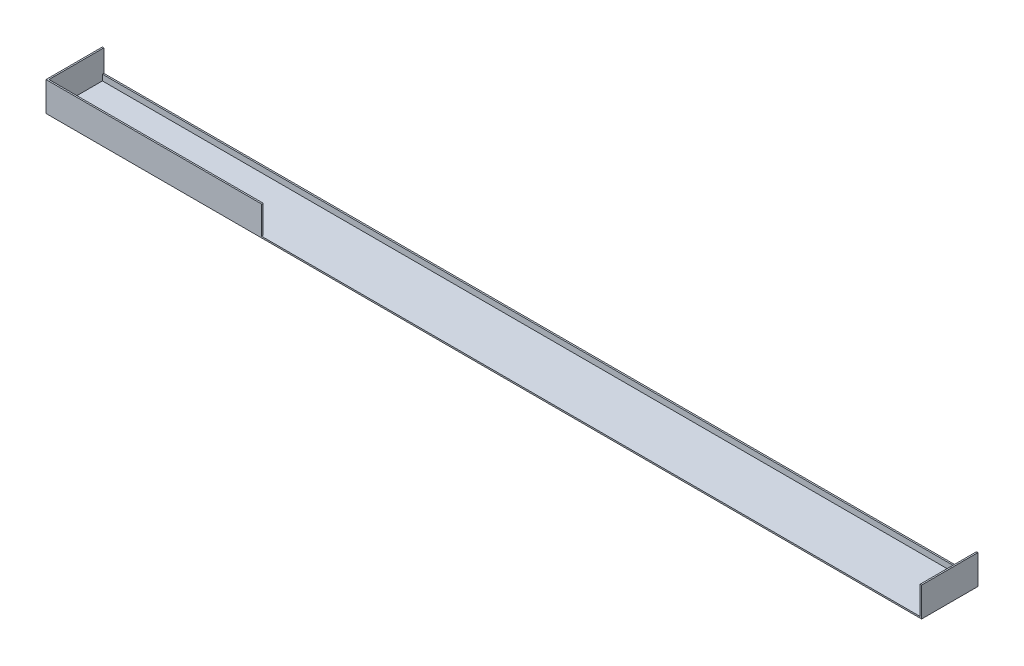
ISO-10303-21;
HEADER;
FILE_DESCRIPTION(('STEP AP214'),'2;1');
FILE_NAME('part.step','',(''),(''),'','','');
FILE_SCHEMA(('AUTOMOTIVE_DESIGN { 1 0 10303 214 1 1 1 1 }'));
ENDSEC;
DATA;
#1=APPLICATION_CONTEXT('core data for automotive mechanical design processes');
#2=APPLICATION_PROTOCOL_DEFINITION('international standard','automotive_design',2000,#1);
#3=PRODUCT_CONTEXT('',#1,'mechanical');
#4=PRODUCT('Part','Part','',(#3));
#5=PRODUCT_RELATED_PRODUCT_CATEGORY('part','',(#4));
#6=PRODUCT_DEFINITION_FORMATION('','',#4);
#7=PRODUCT_DEFINITION_CONTEXT('part definition',#1,'design');
#8=PRODUCT_DEFINITION('design','',#6,#7);
#9=PRODUCT_DEFINITION_SHAPE('','',#8);
#10=(LENGTH_UNIT() NAMED_UNIT(*) SI_UNIT(.MILLI.,.METRE.));
#11=(NAMED_UNIT(*) PLANE_ANGLE_UNIT() SI_UNIT($,.RADIAN.));
#12=(NAMED_UNIT(*) SI_UNIT($,.STERADIAN.) SOLID_ANGLE_UNIT());
#13=UNCERTAINTY_MEASURE_WITH_UNIT(LENGTH_MEASURE(1.E-05),#10,'distance_accuracy_value','');
#14=(GEOMETRIC_REPRESENTATION_CONTEXT(3) GLOBAL_UNCERTAINTY_ASSIGNED_CONTEXT((#13)) GLOBAL_UNIT_ASSIGNED_CONTEXT((#10,
#11,#12)) REPRESENTATION_CONTEXT('',''));
#15=CARTESIAN_POINT('',(0.,0.,0.));
#16=DIRECTION('',(0.,0.,1.));
#17=DIRECTION('',(1.,0.,0.));
#18=AXIS2_PLACEMENT_3D('',#15,#16,#17);
#19=CARTESIAN_POINT('',(595.,-893.5,225.));
#20=DIRECTION('',(1.,0.,0.));
#21=DIRECTION('',(0.,1.,0.));
#22=AXIS2_PLACEMENT_3D('',#19,#20,#21);
#23=PLANE('',#22);
#24=DIRECTION('',(0.,0.,-1.));
#25=VECTOR('',#24,1.);
#26=CARTESIAN_POINT('',(595.,-893.5,340.));
#27=LINE('',#26,#25);
#28=CARTESIAN_POINT('',(595.,-893.5,340.));
#29=VERTEX_POINT('',#28);
#30=CARTESIAN_POINT('',(595.,-893.5,225.));
#31=VERTEX_POINT('',#30);
#32=EDGE_CURVE('E11',#29,#31,#27,.T.);
#33=ORIENTED_EDGE('',*,*,#32,.T.);
#34=DIRECTION('',(0.,1.,0.));
#35=VECTOR('',#34,1.);
#36=CARTESIAN_POINT('',(595.,-893.5,225.));
#37=LINE('',#36,#35);
#38=CARTESIAN_POINT('',(595.,-833.5,225.));
#39=VERTEX_POINT('',#38);
#40=EDGE_CURVE('E27',#31,#39,#37,.T.);
#41=ORIENTED_EDGE('',*,*,#40,.T.);
#42=DIRECTION('',(0.,0.,1.));
#43=VECTOR('',#42,1.);
#44=CARTESIAN_POINT('',(595.,-833.5,225.));
#45=LINE('',#44,#43);
#46=CARTESIAN_POINT('',(595.,-833.5,340.));
#47=VERTEX_POINT('',#46);
#48=EDGE_CURVE('E180',#39,#47,#45,.T.);
#49=ORIENTED_EDGE('',*,*,#48,.T.);
#50=DIRECTION('',(0.,-1.,0.));
#51=VECTOR('',#50,1.);
#52=CARTESIAN_POINT('',(595.,-833.5,340.));
#53=LINE('',#52,#51);
#54=EDGE_CURVE('E163',#47,#29,#53,.T.);
#55=ORIENTED_EDGE('',*,*,#54,.T.);
#56=EDGE_LOOP('',(#33,#41,#49,#55));
#57=FACE_BOUND('',#56,.T.);
#58=ADVANCED_FACE('F17',(#57),#23,.T.);
#59=CARTESIAN_POINT('',(595.,-890.5,340.));
#60=DIRECTION('',(0.,0.,1.));
#61=DIRECTION('',(0.,1.,0.));
#62=AXIS2_PLACEMENT_3D('',#59,#60,#61);
#63=PLANE('',#62);
#64=DIRECTION('',(0.,1.,0.));
#65=VECTOR('',#64,1.);
#66=CARTESIAN_POINT('',(-1191.,-893.5,340.));
#67=LINE('',#66,#65);
#68=CARTESIAN_POINT('',(-1191.,-893.5,340.));
#69=VERTEX_POINT('',#68);
#70=CARTESIAN_POINT('',(-1191.,-833.5,340.));
#71=VERTEX_POINT('',#70);
#72=EDGE_CURVE('E183',#69,#71,#67,.T.);
#73=ORIENTED_EDGE('',*,*,#72,.F.);
#74=DIRECTION('',(-1.,0.,0.));
#75=VECTOR('',#74,1.);
#76=CARTESIAN_POINT('',(595.,-893.5,340.));
#77=LINE('',#76,#75);
#78=EDGE_CURVE('E142',#29,#69,#77,.T.);
#79=ORIENTED_EDGE('',*,*,#78,.F.);
#80=ORIENTED_EDGE('',*,*,#54,.F.);
#81=DIRECTION('',(-1.,0.,0.));
#82=VECTOR('',#81,1.);
#83=CARTESIAN_POINT('',(595.,-833.5,340.));
#84=LINE('',#83,#82);
#85=CARTESIAN_POINT('',(592.,-833.5,340.));
#86=VERTEX_POINT('',#85);
#87=EDGE_CURVE('E160',#47,#86,#84,.T.);
#88=ORIENTED_EDGE('',*,*,#87,.T.);
#89=DIRECTION('',(0.,-1.,0.));
#90=VECTOR('',#89,1.);
#91=CARTESIAN_POINT('',(592.,-833.5,340.));
#92=LINE('',#91,#90);
#93=CARTESIAN_POINT('',(592.,-890.5,340.));
#94=VERTEX_POINT('',#93);
#95=EDGE_CURVE('E164',#86,#94,#92,.T.);
#96=ORIENTED_EDGE('',*,*,#95,.T.);
#97=DIRECTION('',(-1.,0.,0.));
#98=VECTOR('',#97,1.);
#99=CARTESIAN_POINT('',(592.,-890.5,340.));
#100=LINE('',#99,#98);
#101=CARTESIAN_POINT('',(-751.,-890.5,340.));
#102=VERTEX_POINT('',#101);
#103=EDGE_CURVE('E118',#94,#102,#100,.T.);
#104=ORIENTED_EDGE('',*,*,#103,.T.);
#105=DIRECTION('',(0.,1.,0.));
#106=VECTOR('',#105,1.);
#107=CARTESIAN_POINT('',(-751.,-890.5,340.));
#108=LINE('',#107,#106);
#109=CARTESIAN_POINT('',(-751.,-833.5,340.));
#110=VERTEX_POINT('',#109);
#111=EDGE_CURVE('E196',#102,#110,#108,.T.);
#112=ORIENTED_EDGE('',*,*,#111,.T.);
#113=DIRECTION('',(-1.,0.,0.));
#114=VECTOR('',#113,1.);
#115=CARTESIAN_POINT('',(-751.,-833.5,340.));
#116=LINE('',#115,#114);
#117=EDGE_CURVE('E178',#110,#71,#116,.T.);
#118=ORIENTED_EDGE('',*,*,#117,.T.);
#119=EDGE_LOOP('',(#73,#79,#80,#88,#96,#104,#112,#118));
#120=FACE_BOUND('',#119,.T.);
#121=ADVANCED_FACE('F208',(#120),#63,.T.);
#122=CARTESIAN_POINT('',(-1191.,-833.5,340.));
#123=DIRECTION('',(0.,1.,0.));
#124=DIRECTION('',(0.,0.,1.));
#125=AXIS2_PLACEMENT_3D('',#122,#123,#124);
#126=PLANE('',#125);
#127=DIRECTION('',(1.,0.,0.));
#128=VECTOR('',#127,1.);
#129=CARTESIAN_POINT('',(-1191.,-833.5,225.));
#130=LINE('',#129,#128);
#131=CARTESIAN_POINT('',(-1191.,-833.5,225.));
#132=VERTEX_POINT('',#131);
#133=CARTESIAN_POINT('',(-1188.,-833.5,225.));
#134=VERTEX_POINT('',#133);
#135=EDGE_CURVE('E153',#132,#134,#130,.T.);
#136=ORIENTED_EDGE('',*,*,#135,.F.);
#137=DIRECTION('',(0.,0.,-1.));
#138=VECTOR('',#137,1.);
#139=CARTESIAN_POINT('',(-1191.,-833.5,340.));
#140=LINE('',#139,#138);
#141=EDGE_CURVE('E185',#71,#132,#140,.T.);
#142=ORIENTED_EDGE('',*,*,#141,.F.);
#143=ORIENTED_EDGE('',*,*,#117,.F.);
#144=DIRECTION('',(0.,0.,-1.));
#145=VECTOR('',#144,1.);
#146=CARTESIAN_POINT('',(-751.,-833.5,340.));
#147=LINE('',#146,#145);
#148=CARTESIAN_POINT('',(-751.,-833.5,337.));
#149=VERTEX_POINT('',#148);
#150=EDGE_CURVE('E171',#110,#149,#147,.T.);
#151=ORIENTED_EDGE('',*,*,#150,.T.);
#152=DIRECTION('',(-1.,0.,0.));
#153=VECTOR('',#152,1.);
#154=CARTESIAN_POINT('',(-751.,-833.5,337.));
#155=LINE('',#154,#153);
#156=CARTESIAN_POINT('',(-1188.,-833.5,337.));
#157=VERTEX_POINT('',#156);
#158=EDGE_CURVE('E168',#149,#157,#155,.T.);
#159=ORIENTED_EDGE('',*,*,#158,.T.);
#160=DIRECTION('',(0.,0.,-1.));
#161=VECTOR('',#160,1.);
#162=CARTESIAN_POINT('',(-1188.,-833.5,337.));
#163=LINE('',#162,#161);
#164=EDGE_CURVE('E166',#157,#134,#163,.T.);
#165=ORIENTED_EDGE('',*,*,#164,.T.);
#166=EDGE_LOOP('',(#136,#142,#143,#151,#159,#165));
#167=FACE_BOUND('',#166,.T.);
#168=ADVANCED_FACE('F225',(#167),#126,.T.);
#169=CARTESIAN_POINT('',(-1188.,-893.5,225.));
#170=DIRECTION('',(-1.,0.,0.));
#171=DIRECTION('',(0.,0.,-1.));
#172=AXIS2_PLACEMENT_3D('',#169,#170,#171);
#173=PLANE('',#172);
#174=DIRECTION('',(0.,0.,1.));
#175=VECTOR('',#174,1.);
#176=CARTESIAN_POINT('',(-1188.,-890.5,228.));
#177=LINE('',#176,#175);
#178=CARTESIAN_POINT('',(-1188.,-890.5,228.));
#179=VERTEX_POINT('',#178);
#180=CARTESIAN_POINT('',(-1188.,-890.5,337.));
#181=VERTEX_POINT('',#180);
#182=EDGE_CURVE('E131',#179,#181,#177,.T.);
#183=ORIENTED_EDGE('',*,*,#182,.F.);
#184=DIRECTION('',(0.,-1.,0.));
#185=VECTOR('',#184,1.);
#186=CARTESIAN_POINT('',(-1188.,-878.5,228.));
#187=LINE('',#186,#185);
#188=CARTESIAN_POINT('',(-1188.,-878.5,228.));
#189=VERTEX_POINT('',#188);
#190=EDGE_CURVE('E128',#189,#179,#187,.T.);
#191=ORIENTED_EDGE('',*,*,#190,.F.);
#192=DIRECTION('',(0.,0.,1.));
#193=VECTOR('',#192,1.);
#194=CARTESIAN_POINT('',(-1188.,-878.5,225.));
#195=LINE('',#194,#193);
#196=CARTESIAN_POINT('',(-1188.,-878.5,225.));
#197=VERTEX_POINT('',#196);
#198=EDGE_CURVE('E137',#197,#189,#195,.T.);
#199=ORIENTED_EDGE('',*,*,#198,.F.);
#200=DIRECTION('',(0.,-1.,0.));
#201=VECTOR('',#200,1.);
#202=CARTESIAN_POINT('',(-1188.,-833.5,225.));
#203=LINE('',#202,#201);
#204=EDGE_CURVE('E157',#134,#197,#203,.T.);
#205=ORIENTED_EDGE('',*,*,#204,.F.);
#206=ORIENTED_EDGE('',*,*,#164,.F.);
#207=DIRECTION('',(0.,-1.,0.));
#208=VECTOR('',#207,1.);
#209=CARTESIAN_POINT('',(-1188.,-833.5,337.));
#210=LINE('',#209,#208);
#211=EDGE_CURVE('E130',#157,#181,#210,.T.);
#212=ORIENTED_EDGE('',*,*,#211,.T.);
#213=EDGE_LOOP('',(#183,#191,#199,#205,#206,#212));
#214=FACE_BOUND('',#213,.T.);
#215=ADVANCED_FACE('F230',(#214),#173,.F.);
#216=CARTESIAN_POINT('',(595.,-893.5,337.));
#217=DIRECTION('',(0.,0.,1.));
#218=DIRECTION('',(0.,1.,0.));
#219=AXIS2_PLACEMENT_3D('',#216,#217,#218);
#220=PLANE('',#219);
#221=ORIENTED_EDGE('',*,*,#211,.F.);
#222=ORIENTED_EDGE('',*,*,#158,.F.);
#223=DIRECTION('',(0.,1.,0.));
#224=VECTOR('',#223,1.);
#225=CARTESIAN_POINT('',(-751.,-890.5,337.));
#226=LINE('',#225,#224);
#227=CARTESIAN_POINT('',(-751.,-890.5,337.));
#228=VERTEX_POINT('',#227);
#229=EDGE_CURVE('E139',#228,#149,#226,.T.);
#230=ORIENTED_EDGE('',*,*,#229,.F.);
#231=DIRECTION('',(1.,0.,0.));
#232=VECTOR('',#231,1.);
#233=CARTESIAN_POINT('',(-1188.,-890.5,337.));
#234=LINE('',#233,#232);
#235=EDGE_CURVE('E186',#181,#228,#234,.T.);
#236=ORIENTED_EDGE('',*,*,#235,.F.);
#237=EDGE_LOOP('',(#221,#222,#230,#236));
#238=FACE_BOUND('',#237,.T.);
#239=ADVANCED_FACE('F253',(#238),#220,.F.);
#240=CARTESIAN_POINT('',(595.,-890.5,228.));
#241=DIRECTION('',(0.,1.,0.));
#242=DIRECTION('',(0.,0.,1.));
#243=AXIS2_PLACEMENT_3D('',#240,#241,#242);
#244=PLANE('',#243);
#245=DIRECTION('',(0.,0.,-1.));
#246=VECTOR('',#245,1.);
#247=CARTESIAN_POINT('',(-751.,-890.5,340.));
#248=LINE('',#247,#246);
#249=EDGE_CURVE('E176',#102,#228,#248,.T.);
#250=ORIENTED_EDGE('',*,*,#249,.F.);
#251=ORIENTED_EDGE('',*,*,#103,.F.);
#252=DIRECTION('',(0.,0.,1.));
#253=VECTOR('',#252,1.);
#254=CARTESIAN_POINT('',(592.,-890.5,228.));
#255=LINE('',#254,#253);
#256=CARTESIAN_POINT('',(592.,-890.5,228.));
#257=VERTEX_POINT('',#256);
#258=EDGE_CURVE('E112',#257,#94,#255,.T.);
#259=ORIENTED_EDGE('',*,*,#258,.F.);
#260=DIRECTION('',(-1.,0.,0.));
#261=VECTOR('',#260,1.);
#262=CARTESIAN_POINT('',(592.,-890.5,228.));
#263=LINE('',#262,#261);
#264=EDGE_CURVE('E116',#257,#179,#263,.T.);
#265=ORIENTED_EDGE('',*,*,#264,.T.);
#266=ORIENTED_EDGE('',*,*,#182,.T.);
#267=ORIENTED_EDGE('',*,*,#235,.T.);
#268=EDGE_LOOP('',(#250,#251,#259,#265,#266,#267));
#269=FACE_BOUND('',#268,.T.);
#270=ADVANCED_FACE('F115',(#269),#244,.T.);
#271=CARTESIAN_POINT('',(595.,-878.5,228.));
#272=DIRECTION('',(0.,0.,1.));
#273=DIRECTION('',(0.,1.,0.));
#274=AXIS2_PLACEMENT_3D('',#271,#272,#273);
#275=PLANE('',#274);
#276=ORIENTED_EDGE('',*,*,#264,.F.);
#277=DIRECTION('',(0.,-1.,0.));
#278=VECTOR('',#277,1.);
#279=CARTESIAN_POINT('',(592.,-878.5,228.));
#280=LINE('',#279,#278);
#281=CARTESIAN_POINT('',(592.,-878.5,228.));
#282=VERTEX_POINT('',#281);
#283=EDGE_CURVE('E122',#282,#257,#280,.T.);
#284=ORIENTED_EDGE('',*,*,#283,.F.);
#285=DIRECTION('',(-1.,0.,0.));
#286=VECTOR('',#285,1.);
#287=CARTESIAN_POINT('',(592.,-878.5,228.));
#288=LINE('',#287,#286);
#289=EDGE_CURVE('E188',#282,#189,#288,.T.);
#290=ORIENTED_EDGE('',*,*,#289,.T.);
#291=ORIENTED_EDGE('',*,*,#190,.T.);
#292=EDGE_LOOP('',(#276,#284,#290,#291));
#293=FACE_BOUND('',#292,.T.);
#294=ADVANCED_FACE('F125',(#293),#275,.T.);
#295=CARTESIAN_POINT('',(595.,-878.5,225.));
#296=DIRECTION('',(0.,1.,0.));
#297=DIRECTION('',(0.,0.,1.));
#298=AXIS2_PLACEMENT_3D('',#295,#296,#297);
#299=PLANE('',#298);
#300=ORIENTED_EDGE('',*,*,#289,.F.);
#301=DIRECTION('',(0.,0.,1.));
#302=VECTOR('',#301,1.);
#303=CARTESIAN_POINT('',(592.,-878.5,225.));
#304=LINE('',#303,#302);
#305=CARTESIAN_POINT('',(592.,-878.5,225.));
#306=VERTEX_POINT('',#305);
#307=EDGE_CURVE('E88',#306,#282,#304,.T.);
#308=ORIENTED_EDGE('',*,*,#307,.F.);
#309=DIRECTION('',(-1.,0.,0.));
#310=VECTOR('',#309,1.);
#311=CARTESIAN_POINT('',(592.,-878.5,225.));
#312=LINE('',#311,#310);
#313=EDGE_CURVE('E172',#306,#197,#312,.T.);
#314=ORIENTED_EDGE('',*,*,#313,.T.);
#315=ORIENTED_EDGE('',*,*,#198,.T.);
#316=EDGE_LOOP('',(#300,#308,#314,#315));
#317=FACE_BOUND('',#316,.T.);
#318=ADVANCED_FACE('F231',(#317),#299,.T.);
#319=CARTESIAN_POINT('',(595.,-893.5,225.));
#320=DIRECTION('',(0.,0.,-1.));
#321=DIRECTION('',(-1.,0.,0.));
#322=AXIS2_PLACEMENT_3D('',#319,#320,#321);
#323=PLANE('',#322);
#324=DIRECTION('',(0.,1.,0.));
#325=VECTOR('',#324,1.);
#326=CARTESIAN_POINT('',(592.,-878.5,225.));
#327=LINE('',#326,#325);
#328=CARTESIAN_POINT('',(592.,-833.5,225.));
#329=VERTEX_POINT('',#328);
#330=EDGE_CURVE('E158',#306,#329,#327,.T.);
#331=ORIENTED_EDGE('',*,*,#330,.T.);
#332=DIRECTION('',(-1.,0.,0.));
#333=VECTOR('',#332,1.);
#334=CARTESIAN_POINT('',(595.,-833.5,225.));
#335=LINE('',#334,#333);
#336=EDGE_CURVE('E94',#39,#329,#335,.T.);
#337=ORIENTED_EDGE('',*,*,#336,.F.);
#338=ORIENTED_EDGE('',*,*,#40,.F.);
#339=DIRECTION('',(-1.,0.,0.));
#340=VECTOR('',#339,1.);
#341=CARTESIAN_POINT('',(595.,-893.5,225.));
#342=LINE('',#341,#340);
#343=CARTESIAN_POINT('',(-1191.,-893.5,225.));
#344=VERTEX_POINT('',#343);
#345=EDGE_CURVE('E156',#31,#344,#342,.T.);
#346=ORIENTED_EDGE('',*,*,#345,.T.);
#347=DIRECTION('',(0.,-1.,0.));
#348=VECTOR('',#347,1.);
#349=CARTESIAN_POINT('',(-1191.,-833.5,225.));
#350=LINE('',#349,#348);
#351=EDGE_CURVE('E148',#132,#344,#350,.T.);
#352=ORIENTED_EDGE('',*,*,#351,.F.);
#353=ORIENTED_EDGE('',*,*,#135,.T.);
#354=ORIENTED_EDGE('',*,*,#204,.T.);
#355=ORIENTED_EDGE('',*,*,#313,.F.);
#356=EDGE_LOOP('',(#331,#337,#338,#346,#352,#353,#354,#355));
#357=FACE_BOUND('',#356,.T.);
#358=ADVANCED_FACE('F216',(#357),#323,.T.);
#359=CARTESIAN_POINT('',(-1191.,-893.5,225.));
#360=DIRECTION('',(1.,0.,0.));
#361=DIRECTION('',(0.,1.,0.));
#362=AXIS2_PLACEMENT_3D('',#359,#360,#361);
#363=PLANE('',#362);
#364=DIRECTION('',(0.,0.,-1.));
#365=VECTOR('',#364,1.);
#366=CARTESIAN_POINT('',(-1191.,-893.5,340.));
#367=LINE('',#366,#365);
#368=EDGE_CURVE('E140',#69,#344,#367,.T.);
#369=ORIENTED_EDGE('',*,*,#368,.F.);
#370=ORIENTED_EDGE('',*,*,#72,.T.);
#371=ORIENTED_EDGE('',*,*,#141,.T.);
#372=ORIENTED_EDGE('',*,*,#351,.T.);
#373=EDGE_LOOP('',(#369,#370,#371,#372));
#374=FACE_BOUND('',#373,.T.);
#375=ADVANCED_FACE('F213',(#374),#363,.F.);
#376=CARTESIAN_POINT('',(595.,-893.5,340.));
#377=DIRECTION('',(0.,-1.,0.));
#378=DIRECTION('',(1.,0.,0.));
#379=AXIS2_PLACEMENT_3D('',#376,#377,#378);
#380=PLANE('',#379);
#381=ORIENTED_EDGE('',*,*,#78,.T.);
#382=ORIENTED_EDGE('',*,*,#368,.T.);
#383=ORIENTED_EDGE('',*,*,#345,.F.);
#384=ORIENTED_EDGE('',*,*,#32,.F.);
#385=EDGE_LOOP('',(#381,#382,#383,#384));
#386=FACE_BOUND('',#385,.T.);
#387=ADVANCED_FACE('F206',(#386),#380,.T.);
#388=CARTESIAN_POINT('',(595.,-833.5,225.));
#389=DIRECTION('',(0.,1.,0.));
#390=DIRECTION('',(0.,0.,1.));
#391=AXIS2_PLACEMENT_3D('',#388,#389,#390);
#392=PLANE('',#391);
#393=ORIENTED_EDGE('',*,*,#336,.T.);
#394=DIRECTION('',(0.,0.,1.));
#395=VECTOR('',#394,1.);
#396=CARTESIAN_POINT('',(592.,-833.5,225.));
#397=LINE('',#396,#395);
#398=EDGE_CURVE('E21',#329,#86,#397,.T.);
#399=ORIENTED_EDGE('',*,*,#398,.T.);
#400=ORIENTED_EDGE('',*,*,#87,.F.);
#401=ORIENTED_EDGE('',*,*,#48,.F.);
#402=EDGE_LOOP('',(#393,#399,#400,#401));
#403=FACE_BOUND('',#402,.T.);
#404=ADVANCED_FACE('F259',(#403),#392,.T.);
#405=CARTESIAN_POINT('',(592.,-893.5,225.));
#406=DIRECTION('',(1.,0.,0.));
#407=DIRECTION('',(0.,1.,0.));
#408=AXIS2_PLACEMENT_3D('',#405,#406,#407);
#409=PLANE('',#408);
#410=ORIENTED_EDGE('',*,*,#283,.T.);
#411=ORIENTED_EDGE('',*,*,#258,.T.);
#412=ORIENTED_EDGE('',*,*,#95,.F.);
#413=ORIENTED_EDGE('',*,*,#398,.F.);
#414=ORIENTED_EDGE('',*,*,#330,.F.);
#415=ORIENTED_EDGE('',*,*,#307,.T.);
#416=EDGE_LOOP('',(#410,#411,#412,#413,#414,#415));
#417=FACE_BOUND('',#416,.T.);
#418=ADVANCED_FACE('F19',(#417),#409,.F.);
#419=CARTESIAN_POINT('',(-751.,-893.5,340.));
#420=DIRECTION('',(1.,0.,0.));
#421=DIRECTION('',(0.,1.,0.));
#422=AXIS2_PLACEMENT_3D('',#419,#420,#421);
#423=PLANE('',#422);
#424=ORIENTED_EDGE('',*,*,#229,.T.);
#425=ORIENTED_EDGE('',*,*,#150,.F.);
#426=ORIENTED_EDGE('',*,*,#111,.F.);
#427=ORIENTED_EDGE('',*,*,#249,.T.);
#428=EDGE_LOOP('',(#424,#425,#426,#427));
#429=FACE_BOUND('',#428,.T.);
#430=ADVANCED_FACE('F223',(#429),#423,.T.);
#431=CLOSED_SHELL('',(#58,#121,#168,#215,#239,#270,#294,#318,#358,#375,#387,#404,#418,#430));
#432=MANIFOLD_SOLID_BREP('B1',#431);
#433=ADVANCED_BREP_SHAPE_REPRESENTATION('',(#18,#432),#14);
#434=SHAPE_DEFINITION_REPRESENTATION(#9,#433);
ENDSEC;
END-ISO-10303-21;
